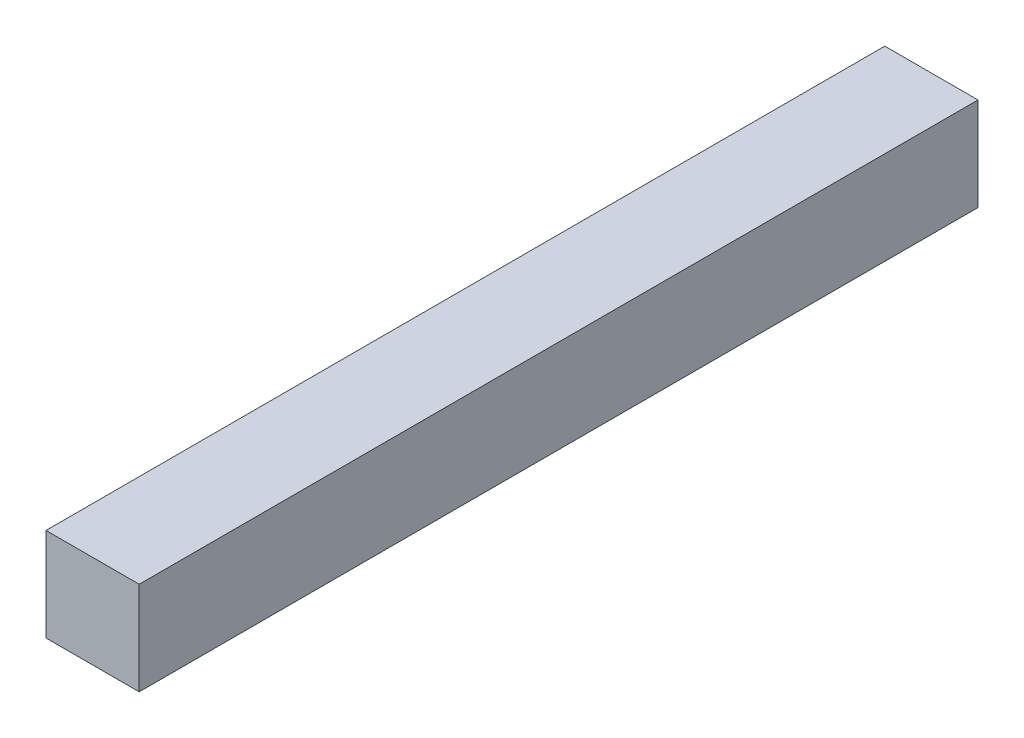
ISO-10303-21;
HEADER;
FILE_DESCRIPTION(('STEP AP214'),'2;1');
FILE_NAME('part.step','',(''),(''),'','','');
FILE_SCHEMA(('AUTOMOTIVE_DESIGN { 1 0 10303 214 1 1 1 1 }'));
ENDSEC;
DATA;
#1=APPLICATION_CONTEXT('core data for automotive mechanical design processes');
#2=APPLICATION_PROTOCOL_DEFINITION('international standard','automotive_design',2000,#1);
#3=PRODUCT_CONTEXT('',#1,'mechanical');
#4=PRODUCT('Part','Part','',(#3));
#5=PRODUCT_RELATED_PRODUCT_CATEGORY('part','',(#4));
#6=PRODUCT_DEFINITION_FORMATION('','',#4);
#7=PRODUCT_DEFINITION_CONTEXT('part definition',#1,'design');
#8=PRODUCT_DEFINITION('design','',#6,#7);
#9=PRODUCT_DEFINITION_SHAPE('','',#8);
#10=(LENGTH_UNIT() NAMED_UNIT(*) SI_UNIT(.MILLI.,.METRE.));
#11=(NAMED_UNIT(*) PLANE_ANGLE_UNIT() SI_UNIT($,.RADIAN.));
#12=(NAMED_UNIT(*) SI_UNIT($,.STERADIAN.) SOLID_ANGLE_UNIT());
#13=UNCERTAINTY_MEASURE_WITH_UNIT(LENGTH_MEASURE(1.E-05),#10,'distance_accuracy_value','');
#14=(GEOMETRIC_REPRESENTATION_CONTEXT(3) GLOBAL_UNCERTAINTY_ASSIGNED_CONTEXT((#13)) GLOBAL_UNIT_ASSIGNED_CONTEXT((#10,
#11,#12)) REPRESENTATION_CONTEXT('',''));
#15=CARTESIAN_POINT('',(0.,0.,0.));
#16=DIRECTION('',(0.,0.,1.));
#17=DIRECTION('',(1.,0.,0.));
#18=AXIS2_PLACEMENT_3D('',#15,#16,#17);
#19=CARTESIAN_POINT('',(-10.,10.,180.));
#20=DIRECTION('',(1.,0.,0.));
#21=DIRECTION('',(0.,1.,0.));
#22=AXIS2_PLACEMENT_3D('',#19,#20,#21);
#23=PLANE('',#22);
#24=DIRECTION('',(0.,-1.,0.));
#25=VECTOR('',#24,1.);
#26=CARTESIAN_POINT('',(-10.,10.,0.));
#27=LINE('',#26,#25);
#28=CARTESIAN_POINT('',(-10.,10.,0.));
#29=VERTEX_POINT('',#28);
#30=CARTESIAN_POINT('',(-10.,-10.,0.));
#31=VERTEX_POINT('',#30);
#32=EDGE_CURVE('E96',#29,#31,#27,.T.);
#33=ORIENTED_EDGE('',*,*,#32,.T.);
#34=DIRECTION('',(0.,0.,-1.));
#35=VECTOR('',#34,1.);
#36=CARTESIAN_POINT('',(-10.,-10.,180.));
#37=LINE('',#36,#35);
#38=CARTESIAN_POINT('',(-10.,-10.,180.));
#39=VERTEX_POINT('',#38);
#40=EDGE_CURVE('E11',#39,#31,#37,.T.);
#41=ORIENTED_EDGE('',*,*,#40,.F.);
#42=DIRECTION('',(0.,-1.,0.));
#43=VECTOR('',#42,1.);
#44=CARTESIAN_POINT('',(-10.,10.,180.));
#45=LINE('',#44,#43);
#46=CARTESIAN_POINT('',(-10.,10.,180.));
#47=VERTEX_POINT('',#46);
#48=EDGE_CURVE('E84',#47,#39,#45,.T.);
#49=ORIENTED_EDGE('',*,*,#48,.F.);
#50=DIRECTION('',(0.,0.,-1.));
#51=VECTOR('',#50,1.);
#52=CARTESIAN_POINT('',(-10.,10.,180.));
#53=LINE('',#52,#51);
#54=EDGE_CURVE('E92',#47,#29,#53,.T.);
#55=ORIENTED_EDGE('',*,*,#54,.T.);
#56=EDGE_LOOP('',(#33,#41,#49,#55));
#57=FACE_BOUND('',#56,.T.);
#58=ADVANCED_FACE('F33',(#57),#23,.F.);
#59=CARTESIAN_POINT('',(-10.,-10.,180.));
#60=DIRECTION('',(0.,1.,0.));
#61=DIRECTION('',(0.,0.,1.));
#62=AXIS2_PLACEMENT_3D('',#59,#60,#61);
#63=PLANE('',#62);
#64=DIRECTION('',(1.,0.,0.));
#65=VECTOR('',#64,1.);
#66=CARTESIAN_POINT('',(-10.,-10.,0.));
#67=LINE('',#66,#65);
#68=CARTESIAN_POINT('',(10.,-10.,0.));
#69=VERTEX_POINT('',#68);
#70=EDGE_CURVE('E88',#31,#69,#67,.T.);
#71=ORIENTED_EDGE('',*,*,#70,.T.);
#72=DIRECTION('',(0.,0.,-1.));
#73=VECTOR('',#72,1.);
#74=CARTESIAN_POINT('',(10.,-10.,180.));
#75=LINE('',#74,#73);
#76=CARTESIAN_POINT('',(10.,-10.,180.));
#77=VERTEX_POINT('',#76);
#78=EDGE_CURVE('E41',#77,#69,#75,.T.);
#79=ORIENTED_EDGE('',*,*,#78,.F.);
#80=DIRECTION('',(1.,0.,0.));
#81=VECTOR('',#80,1.);
#82=CARTESIAN_POINT('',(-10.,-10.,180.));
#83=LINE('',#82,#81);
#84=EDGE_CURVE('E79',#39,#77,#83,.T.);
#85=ORIENTED_EDGE('',*,*,#84,.F.);
#86=ORIENTED_EDGE('',*,*,#40,.T.);
#87=EDGE_LOOP('',(#71,#79,#85,#86));
#88=FACE_BOUND('',#87,.T.);
#89=ADVANCED_FACE('F87',(#88),#63,.F.);
#90=CARTESIAN_POINT('',(10.,10.,180.));
#91=DIRECTION('',(-1.,0.,0.));
#92=DIRECTION('',(0.,0.,1.));
#93=AXIS2_PLACEMENT_3D('',#90,#91,#92);
#94=PLANE('',#93);
#95=DIRECTION('',(0.,1.,0.));
#96=VECTOR('',#95,1.);
#97=CARTESIAN_POINT('',(10.,10.,0.));
#98=LINE('',#97,#96);
#99=CARTESIAN_POINT('',(10.,10.,0.));
#100=VERTEX_POINT('',#99);
#101=EDGE_CURVE('E66',#69,#100,#98,.T.);
#102=ORIENTED_EDGE('',*,*,#101,.T.);
#103=DIRECTION('',(0.,0.,-1.));
#104=VECTOR('',#103,1.);
#105=CARTESIAN_POINT('',(10.,10.,180.));
#106=LINE('',#105,#104);
#107=CARTESIAN_POINT('',(10.,10.,180.));
#108=VERTEX_POINT('',#107);
#109=EDGE_CURVE('E89',#108,#100,#106,.T.);
#110=ORIENTED_EDGE('',*,*,#109,.F.);
#111=DIRECTION('',(0.,1.,0.));
#112=VECTOR('',#111,1.);
#113=CARTESIAN_POINT('',(10.,10.,180.));
#114=LINE('',#113,#112);
#115=EDGE_CURVE('E82',#77,#108,#114,.T.);
#116=ORIENTED_EDGE('',*,*,#115,.F.);
#117=ORIENTED_EDGE('',*,*,#78,.T.);
#118=EDGE_LOOP('',(#102,#110,#116,#117));
#119=FACE_BOUND('',#118,.T.);
#120=ADVANCED_FACE('F90',(#119),#94,.F.);
#121=CARTESIAN_POINT('',(-10.,10.,180.));
#122=DIRECTION('',(0.,-1.,0.));
#123=DIRECTION('',(0.,0.,-1.));
#124=AXIS2_PLACEMENT_3D('',#121,#122,#123);
#125=PLANE('',#124);
#126=DIRECTION('',(-1.,0.,0.));
#127=VECTOR('',#126,1.);
#128=CARTESIAN_POINT('',(-10.,10.,0.));
#129=LINE('',#128,#127);
#130=EDGE_CURVE('E72',#100,#29,#129,.T.);
#131=ORIENTED_EDGE('',*,*,#130,.T.);
#132=ORIENTED_EDGE('',*,*,#54,.F.);
#133=DIRECTION('',(-1.,0.,0.));
#134=VECTOR('',#133,1.);
#135=CARTESIAN_POINT('',(-10.,10.,180.));
#136=LINE('',#135,#134);
#137=EDGE_CURVE('E49',#108,#47,#136,.T.);
#138=ORIENTED_EDGE('',*,*,#137,.F.);
#139=ORIENTED_EDGE('',*,*,#109,.T.);
#140=EDGE_LOOP('',(#131,#132,#138,#139));
#141=FACE_BOUND('',#140,.T.);
#142=ADVANCED_FACE('F103',(#141),#125,.F.);
#143=CARTESIAN_POINT('',(0.,0.,180.));
#144=DIRECTION('',(0.,0.,1.));
#145=DIRECTION('',(1.,0.,0.));
#146=AXIS2_PLACEMENT_3D('',#143,#144,#145);
#147=PLANE('',#146);
#148=ORIENTED_EDGE('',*,*,#48,.T.);
#149=ORIENTED_EDGE('',*,*,#84,.T.);
#150=ORIENTED_EDGE('',*,*,#115,.T.);
#151=ORIENTED_EDGE('',*,*,#137,.T.);
#152=EDGE_LOOP('',(#148,#149,#150,#151));
#153=FACE_BOUND('',#152,.T.);
#154=ADVANCED_FACE('F80',(#153),#147,.T.);
#155=CARTESIAN_POINT('',(0.,0.,0.));
#156=DIRECTION('',(0.,0.,1.));
#157=DIRECTION('',(1.,0.,0.));
#158=AXIS2_PLACEMENT_3D('',#155,#156,#157);
#159=PLANE('',#158);
#160=ORIENTED_EDGE('',*,*,#32,.F.);
#161=ORIENTED_EDGE('',*,*,#130,.F.);
#162=ORIENTED_EDGE('',*,*,#101,.F.);
#163=ORIENTED_EDGE('',*,*,#70,.F.);
#164=EDGE_LOOP('',(#160,#161,#162,#163));
#165=FACE_BOUND('',#164,.T.);
#166=ADVANCED_FACE('F106',(#165),#159,.F.);
#167=CLOSED_SHELL('',(#58,#89,#120,#142,#154,#166));
#168=MANIFOLD_SOLID_BREP('B2',#167);
#169=ADVANCED_BREP_SHAPE_REPRESENTATION('',(#18,#168),#14);
#170=SHAPE_DEFINITION_REPRESENTATION(#9,#169);
ENDSEC;
END-ISO-10303-21;
